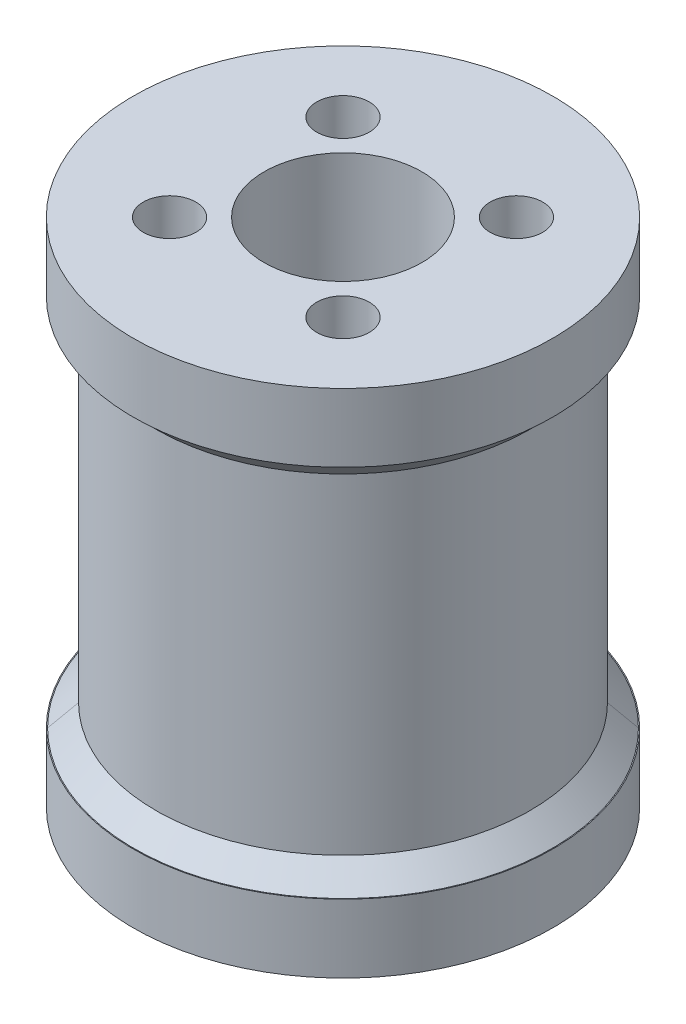
ISO-10303-21;
HEADER;
FILE_DESCRIPTION(('STEP AP214'),'2;1');
FILE_NAME('part.step','',(''),(''),'','','');
FILE_SCHEMA(('AUTOMOTIVE_DESIGN { 1 0 10303 214 1 1 1 1 }'));
ENDSEC;
DATA;
#1=APPLICATION_CONTEXT('core data for automotive mechanical design processes');
#2=APPLICATION_PROTOCOL_DEFINITION('international standard','automotive_design',2000,#1);
#3=PRODUCT_CONTEXT('',#1,'mechanical');
#4=PRODUCT('Part','Part','',(#3));
#5=PRODUCT_RELATED_PRODUCT_CATEGORY('part','',(#4));
#6=PRODUCT_DEFINITION_FORMATION('','',#4);
#7=PRODUCT_DEFINITION_CONTEXT('part definition',#1,'design');
#8=PRODUCT_DEFINITION('design','',#6,#7);
#9=PRODUCT_DEFINITION_SHAPE('','',#8);
#10=(LENGTH_UNIT() NAMED_UNIT(*) SI_UNIT(.MILLI.,.METRE.));
#11=(NAMED_UNIT(*) PLANE_ANGLE_UNIT() SI_UNIT($,.RADIAN.));
#12=(NAMED_UNIT(*) SI_UNIT($,.STERADIAN.) SOLID_ANGLE_UNIT());
#13=UNCERTAINTY_MEASURE_WITH_UNIT(LENGTH_MEASURE(1.E-05),#10,'distance_accuracy_value','');
#14=(GEOMETRIC_REPRESENTATION_CONTEXT(3) GLOBAL_UNCERTAINTY_ASSIGNED_CONTEXT((#13)) GLOBAL_UNIT_ASSIGNED_CONTEXT((#10,
#11,#12)) REPRESENTATION_CONTEXT('',''));
#15=CARTESIAN_POINT('',(0.,0.,0.));
#16=DIRECTION('',(0.,0.,1.));
#17=DIRECTION('',(1.,0.,0.));
#18=AXIS2_PLACEMENT_3D('',#15,#16,#17);
#19=CARTESIAN_POINT('',(-2.38771494566887,150.57,4.93724746830686));
#20=DIRECTION('',(0.,-1.,0.));
#21=DIRECTION('',(0.707106781186548,0.,-0.707106781186547));
#22=AXIS2_PLACEMENT_3D('',#19,#20,#21);
#23=CYLINDRICAL_SURFACE('',#22,1.5);
#24=DIRECTION('',(0.,-1.,0.));
#25=VECTOR('',#24,1.);
#26=CARTESIAN_POINT('',(-3.44837511744869,150.57,5.99790764008668));
#27=LINE('',#26,#25);
#28=CARTESIAN_POINT('',(-3.44837511744869,150.57,5.99790764008668));
#29=VERTEX_POINT('',#28);
#30=CARTESIAN_POINT('',(-3.44837511744866,121.42,5.99790764008665));
#31=VERTEX_POINT('',#30);
#32=EDGE_CURVE('E20',#29,#31,#27,.T.);
#33=ORIENTED_EDGE('',*,*,#32,.F.);
#34=CARTESIAN_POINT('',(-2.38771494566887,150.57,4.93724746830686));
#35=DIRECTION('',(0.,-1.,0.));
#36=DIRECTION('',(0.707106781186548,0.,-0.707106781186547));
#37=AXIS2_PLACEMENT_3D('',#34,#35,#36);
#38=CIRCLE('',#37,1.5);
#39=CARTESIAN_POINT('',(-1.32705477388904,150.57,3.87658729652704));
#40=VERTEX_POINT('',#39);
#41=EDGE_CURVE('E140',#40,#29,#38,.T.);
#42=ORIENTED_EDGE('',*,*,#41,.F.);
#43=DIRECTION('',(0.,-1.,0.));
#44=VECTOR('',#43,1.);
#45=CARTESIAN_POINT('',(-1.32705477388904,150.57,3.87658729652704));
#46=LINE('',#45,#44);
#47=CARTESIAN_POINT('',(-1.32705477388901,121.42,3.87658729652701));
#48=VERTEX_POINT('',#47);
#49=EDGE_CURVE('E246',#40,#48,#46,.T.);
#50=ORIENTED_EDGE('',*,*,#49,.T.);
#51=CARTESIAN_POINT('',(-2.38771494566884,121.42,4.93724746830683));
#52=DIRECTION('',(0.,-1.,0.));
#53=DIRECTION('',(0.707106781186548,0.,-0.707106781186547));
#54=AXIS2_PLACEMENT_3D('',#51,#52,#53);
#55=CIRCLE('',#54,1.5);
#56=EDGE_CURVE('E150',#48,#31,#55,.T.);
#57=ORIENTED_EDGE('',*,*,#56,.T.);
#58=EDGE_LOOP('',(#33,#42,#50,#57));
#59=FACE_BOUND('',#58,.T.);
#60=ADVANCED_FACE('F16',(#59),#23,.F.);
#61=CARTESIAN_POINT('',(7.51177999094282,150.57,4.93724746830685));
#62=DIRECTION('',(0.,-1.,0.));
#63=DIRECTION('',(0.707106781186548,0.,-0.707106781186547));
#64=AXIS2_PLACEMENT_3D('',#61,#62,#63);
#65=CYLINDRICAL_SURFACE('',#64,1.5);
#66=DIRECTION('',(0.,-1.,0.));
#67=VECTOR('',#66,1.);
#68=CARTESIAN_POINT('',(6.45111981916299,150.57,5.99790764008667));
#69=LINE('',#68,#67);
#70=CARTESIAN_POINT('',(6.45111981916299,150.57,5.99790764008667));
#71=VERTEX_POINT('',#70);
#72=CARTESIAN_POINT('',(6.45111981916302,121.42,5.99790764008664));
#73=VERTEX_POINT('',#72);
#74=EDGE_CURVE('E245',#71,#73,#69,.T.);
#75=ORIENTED_EDGE('',*,*,#74,.F.);
#76=CARTESIAN_POINT('',(7.51177999094282,150.57,4.93724746830685));
#77=DIRECTION('',(0.,-1.,0.));
#78=DIRECTION('',(0.707106781186548,0.,-0.707106781186547));
#79=AXIS2_PLACEMENT_3D('',#76,#77,#78);
#80=CIRCLE('',#79,1.5);
#81=CARTESIAN_POINT('',(8.57244016272264,150.57,3.87658729652703));
#82=VERTEX_POINT('',#81);
#83=EDGE_CURVE('E201',#82,#71,#80,.T.);
#84=ORIENTED_EDGE('',*,*,#83,.F.);
#85=DIRECTION('',(0.,-1.,0.));
#86=VECTOR('',#85,1.);
#87=CARTESIAN_POINT('',(8.57244016272264,150.57,3.87658729652703));
#88=LINE('',#87,#86);
#89=CARTESIAN_POINT('',(8.57244016272267,121.42,3.876587296527));
#90=VERTEX_POINT('',#89);
#91=EDGE_CURVE('E229',#82,#90,#88,.T.);
#92=ORIENTED_EDGE('',*,*,#91,.T.);
#93=CARTESIAN_POINT('',(7.51177999094285,121.42,4.93724746830682));
#94=DIRECTION('',(0.,-1.,0.));
#95=DIRECTION('',(0.707106781186548,0.,-0.707106781186547));
#96=AXIS2_PLACEMENT_3D('',#93,#94,#95);
#97=CIRCLE('',#96,1.5);
#98=EDGE_CURVE('E264',#90,#73,#97,.T.);
#99=ORIENTED_EDGE('',*,*,#98,.T.);
#100=EDGE_LOOP('',(#75,#84,#92,#99));
#101=FACE_BOUND('',#100,.T.);
#102=ADVANCED_FACE('F509',(#101),#65,.F.);
#103=CARTESIAN_POINT('',(7.51177999094277,150.57,-4.96224746830483));
#104=DIRECTION('',(0.,-1.,0.));
#105=DIRECTION('',(0.707106781186548,0.,-0.707106781186547));
#106=AXIS2_PLACEMENT_3D('',#103,#104,#105);
#107=CYLINDRICAL_SURFACE('',#106,1.5);
#108=DIRECTION('',(0.,-1.,0.));
#109=VECTOR('',#108,1.);
#110=CARTESIAN_POINT('',(6.45111981916295,150.57,-3.90158729652501));
#111=LINE('',#110,#109);
#112=CARTESIAN_POINT('',(6.45111981916295,150.57,-3.90158729652501));
#113=VERTEX_POINT('',#112);
#114=CARTESIAN_POINT('',(6.45111981916298,121.42,-3.90158729652504));
#115=VERTEX_POINT('',#114);
#116=EDGE_CURVE('E228',#113,#115,#111,.T.);
#117=ORIENTED_EDGE('',*,*,#116,.F.);
#118=CARTESIAN_POINT('',(7.51177999094277,150.57,-4.96224746830483));
#119=DIRECTION('',(0.,-1.,0.));
#120=DIRECTION('',(0.707106781186548,0.,-0.707106781186547));
#121=AXIS2_PLACEMENT_3D('',#118,#119,#120);
#122=CIRCLE('',#121,1.5);
#123=CARTESIAN_POINT('',(8.5724401627226,150.57,-6.02290764008466));
#124=VERTEX_POINT('',#123);
#125=EDGE_CURVE('E258',#124,#113,#122,.T.);
#126=ORIENTED_EDGE('',*,*,#125,.F.);
#127=DIRECTION('',(0.,-1.,0.));
#128=VECTOR('',#127,1.);
#129=CARTESIAN_POINT('',(8.5724401627226,150.57,-6.02290764008466));
#130=LINE('',#129,#128);
#131=CARTESIAN_POINT('',(8.57244016272262,121.42,-6.02290764008468));
#132=VERTEX_POINT('',#131);
#133=EDGE_CURVE('E209',#124,#132,#130,.T.);
#134=ORIENTED_EDGE('',*,*,#133,.T.);
#135=CARTESIAN_POINT('',(7.5117799909428,121.42,-4.96224746830486));
#136=DIRECTION('',(0.,-1.,0.));
#137=DIRECTION('',(0.707106781186548,0.,-0.707106781186547));
#138=AXIS2_PLACEMENT_3D('',#135,#136,#137);
#139=CIRCLE('',#138,1.5);
#140=EDGE_CURVE('E261',#132,#115,#139,.T.);
#141=ORIENTED_EDGE('',*,*,#140,.T.);
#142=EDGE_LOOP('',(#117,#126,#134,#141));
#143=FACE_BOUND('',#142,.T.);
#144=ADVANCED_FACE('F547',(#143),#107,.F.);
#145=CARTESIAN_POINT('',(-2.38771494566891,150.57,-4.96224746830475));
#146=DIRECTION('',(0.,-1.,0.));
#147=DIRECTION('',(0.707106781186548,0.,-0.707106781186547));
#148=AXIS2_PLACEMENT_3D('',#145,#146,#147);
#149=CYLINDRICAL_SURFACE('',#148,1.5);
#150=DIRECTION('',(0.,-1.,0.));
#151=VECTOR('',#150,1.);
#152=CARTESIAN_POINT('',(-3.44837511744873,150.57,-3.90158729652493));
#153=LINE('',#152,#151);
#154=CARTESIAN_POINT('',(-3.44837511744873,150.57,-3.90158729652493));
#155=VERTEX_POINT('',#154);
#156=CARTESIAN_POINT('',(-3.4483751174487,121.42,-3.90158729652496));
#157=VERTEX_POINT('',#156);
#158=EDGE_CURVE('E329',#155,#157,#153,.T.);
#159=ORIENTED_EDGE('',*,*,#158,.F.);
#160=CARTESIAN_POINT('',(-2.38771494566891,150.57,-4.96224746830475));
#161=DIRECTION('',(0.,-1.,0.));
#162=DIRECTION('',(0.707106781186548,0.,-0.707106781186547));
#163=AXIS2_PLACEMENT_3D('',#160,#161,#162);
#164=CIRCLE('',#163,1.5);
#165=CARTESIAN_POINT('',(-1.32705477388909,150.57,-6.02290764008457));
#166=VERTEX_POINT('',#165);
#167=EDGE_CURVE('E255',#166,#155,#164,.T.);
#168=ORIENTED_EDGE('',*,*,#167,.F.);
#169=DIRECTION('',(0.,-1.,0.));
#170=VECTOR('',#169,1.);
#171=CARTESIAN_POINT('',(-1.32705477388909,150.57,-6.02290764008457));
#172=LINE('',#171,#170);
#173=CARTESIAN_POINT('',(-1.32705477388906,121.42,-6.0229076400846));
#174=VERTEX_POINT('',#173);
#175=EDGE_CURVE('E208',#166,#174,#172,.T.);
#176=ORIENTED_EDGE('',*,*,#175,.T.);
#177=CARTESIAN_POINT('',(-2.38771494566888,121.42,-4.96224746830478));
#178=DIRECTION('',(0.,-1.,0.));
#179=DIRECTION('',(0.707106781186548,0.,-0.707106781186547));
#180=AXIS2_PLACEMENT_3D('',#177,#178,#179);
#181=CIRCLE('',#180,1.5);
#182=EDGE_CURVE('E263',#174,#157,#181,.T.);
#183=ORIENTED_EDGE('',*,*,#182,.T.);
#184=EDGE_LOOP('',(#159,#168,#176,#183));
#185=FACE_BOUND('',#184,.T.);
#186=ADVANCED_FACE('F605',(#185),#149,.F.);
#187=CARTESIAN_POINT('',(2.56203252263697,150.57,-0.0124999999989708));
#188=DIRECTION('',(0.,-1.,0.));
#189=DIRECTION('',(0.707106781186548,0.,-0.707106781186547));
#190=AXIS2_PLACEMENT_3D('',#187,#188,#189);
#191=CYLINDRICAL_SURFACE('',#190,4.5);
#192=DIRECTION('',(0.,-1.,0.));
#193=VECTOR('',#192,1.);
#194=CARTESIAN_POINT('',(-0.619947992702494,150.57,3.16948051534049));
#195=LINE('',#194,#193);
#196=CARTESIAN_POINT('',(-0.619947992702494,150.57,3.16948051534049));
#197=VERTEX_POINT('',#196);
#198=CARTESIAN_POINT('',(-0.619947992702465,121.42,3.16948051534046));
#199=VERTEX_POINT('',#198);
#200=EDGE_CURVE('E207',#197,#199,#195,.T.);
#201=ORIENTED_EDGE('',*,*,#200,.F.);
#202=CARTESIAN_POINT('',(2.56203252263697,150.57,-0.0124999999989708));
#203=DIRECTION('',(0.,-1.,0.));
#204=DIRECTION('',(0.707106781186548,0.,-0.707106781186547));
#205=AXIS2_PLACEMENT_3D('',#202,#203,#204);
#206=CIRCLE('',#205,4.5);
#207=CARTESIAN_POINT('',(5.74401303797644,150.57,-3.19448051533843));
#208=VERTEX_POINT('',#207);
#209=EDGE_CURVE('E27',#208,#197,#206,.T.);
#210=ORIENTED_EDGE('',*,*,#209,.F.);
#211=DIRECTION('',(0.,-1.,0.));
#212=VECTOR('',#211,1.);
#213=CARTESIAN_POINT('',(5.74401303797644,150.57,-3.19448051533843));
#214=LINE('',#213,#212);
#215=CARTESIAN_POINT('',(5.74401303797647,121.42,-3.19448051533846));
#216=VERTEX_POINT('',#215);
#217=EDGE_CURVE('E299',#208,#216,#214,.T.);
#218=ORIENTED_EDGE('',*,*,#217,.T.);
#219=CARTESIAN_POINT('',(2.562032522637,121.42,-0.012499999999));
#220=DIRECTION('',(0.,-1.,0.));
#221=DIRECTION('',(0.707106781186548,0.,-0.707106781186547));
#222=AXIS2_PLACEMENT_3D('',#219,#220,#221);
#223=CIRCLE('',#222,4.5);
#224=EDGE_CURVE('E240',#216,#199,#223,.T.);
#225=ORIENTED_EDGE('',*,*,#224,.T.);
#226=EDGE_LOOP('',(#201,#210,#218,#225));
#227=FACE_BOUND('',#226,.T.);
#228=ADVANCED_FACE('F819',(#227),#191,.F.);
#229=CARTESIAN_POINT('',(2.56203252263697,146.67,-0.0124999999989747));
#230=DIRECTION('',(0.,1.,0.));
#231=DIRECTION('',(-0.707106781186548,0.,0.707106781186547));
#232=AXIS2_PLACEMENT_3D('',#229,#230,#231);
#233=CONICAL_SURFACE('',#232,11.925,0.785398163397455);
#234=DIRECTION('',(0.500000000000003,0.707106781186544,-0.500000000000002));
#235=VECTOR('',#234,1.);
#236=CARTESIAN_POINT('',(10.9942808882866,146.67,-8.44474836564855));
#237=LINE('',#236,#235);
#238=CARTESIAN_POINT('',(10.1103974118034,145.42,-7.56086488916537));
#239=VERTEX_POINT('',#238);
#240=CARTESIAN_POINT('',(10.9942808882866,146.67,-8.44474836564855));
#241=VERTEX_POINT('',#240);
#242=EDGE_CURVE('E230',#239,#241,#237,.T.);
#243=ORIENTED_EDGE('',*,*,#242,.F.);
#244=CARTESIAN_POINT('',(2.56203252263698,145.42,-0.012499999998976));
#245=DIRECTION('',(0.,-1.,0.));
#246=DIRECTION('',(-0.707106781186548,0.,0.707106781186547));
#247=AXIS2_PLACEMENT_3D('',#244,#245,#246);
#248=CIRCLE('',#247,10.675);
#249=CARTESIAN_POINT('',(-4.98633236652942,145.42,7.53586488916741));
#250=VERTEX_POINT('',#249);
#251=EDGE_CURVE('E236',#250,#239,#248,.T.);
#252=ORIENTED_EDGE('',*,*,#251,.F.);
#253=DIRECTION('',(-0.500000000000004,0.707106781186542,0.500000000000003));
#254=VECTOR('',#253,1.);
#255=CARTESIAN_POINT('',(-5.87021584301261,146.67,8.4197483656506));
#256=LINE('',#255,#254);
#257=CARTESIAN_POINT('',(-5.87021584301261,146.67,8.4197483656506));
#258=VERTEX_POINT('',#257);
#259=EDGE_CURVE('E306',#250,#258,#256,.T.);
#260=ORIENTED_EDGE('',*,*,#259,.T.);
#261=CARTESIAN_POINT('',(2.56203252263697,146.67,-0.0124999999989747));
#262=DIRECTION('',(0.,1.,0.));
#263=DIRECTION('',(-0.707106781186548,0.,0.707106781186547));
#264=AXIS2_PLACEMENT_3D('',#261,#262,#263);
#265=CIRCLE('',#264,11.925);
#266=EDGE_CURVE('E10',#241,#258,#265,.T.);
#267=ORIENTED_EDGE('',*,*,#266,.F.);
#268=EDGE_LOOP('',(#243,#252,#260,#267));
#269=FACE_BOUND('',#268,.T.);
#270=ADVANCED_FACE('F580',(#269),#233,.T.);
#271=CARTESIAN_POINT('',(2.56203252263699,126.57,-0.0124999999989948));
#272=DIRECTION('',(0.,-1.,0.));
#273=DIRECTION('',(0.707106781186548,0.,-0.707106781186547));
#274=AXIS2_PLACEMENT_3D('',#271,#272,#273);
#275=CONICAL_SURFACE('',#274,10.675,0.785398163397445);
#276=DIRECTION('',(-0.499999999999998,-0.707106781186551,0.499999999999997));
#277=VECTOR('',#276,1.);
#278=CARTESIAN_POINT('',(-4.9863323665294,126.57,7.5358648891674));
#279=LINE('',#278,#277);
#280=CARTESIAN_POINT('',(-4.9863323665294,126.57,7.5358648891674));
#281=VERTEX_POINT('',#280);
#282=CARTESIAN_POINT('',(-5.87021584301259,125.32,8.41974836565058));
#283=VERTEX_POINT('',#282);
#284=EDGE_CURVE('E307',#281,#283,#279,.T.);
#285=ORIENTED_EDGE('',*,*,#284,.F.);
#286=CARTESIAN_POINT('',(2.56203252263699,126.57,-0.0124999999989948));
#287=DIRECTION('',(0.,1.,0.));
#288=DIRECTION('',(-0.707106781186548,0.,0.707106781186547));
#289=AXIS2_PLACEMENT_3D('',#286,#287,#288);
#290=CIRCLE('',#289,10.675);
#291=CARTESIAN_POINT('',(10.1103974118034,126.57,-7.56086488916539));
#292=VERTEX_POINT('',#291);
#293=EDGE_CURVE('E198',#292,#281,#290,.T.);
#294=ORIENTED_EDGE('',*,*,#293,.F.);
#295=DIRECTION('',(0.499999999999999,-0.707106781186549,-0.499999999999999));
#296=VECTOR('',#295,1.);
#297=CARTESIAN_POINT('',(10.1103974118034,126.57,-7.56086488916539));
#298=LINE('',#297,#296);
#299=CARTESIAN_POINT('',(10.9942808882866,125.32,-8.44474836564857));
#300=VERTEX_POINT('',#299);
#301=EDGE_CURVE('E218',#292,#300,#298,.T.);
#302=ORIENTED_EDGE('',*,*,#301,.T.);
#303=CARTESIAN_POINT('',(2.562032522637,125.32,-0.0124999999989961));
#304=DIRECTION('',(0.,-1.,0.));
#305=DIRECTION('',(-0.707106781186548,0.,0.707106781186547));
#306=AXIS2_PLACEMENT_3D('',#303,#304,#305);
#307=CIRCLE('',#306,11.925);
#308=EDGE_CURVE('E217',#283,#300,#307,.T.);
#309=ORIENTED_EDGE('',*,*,#308,.F.);
#310=EDGE_LOOP('',(#285,#294,#302,#309));
#311=FACE_BOUND('',#310,.T.);
#312=ADVANCED_FACE('F800',(#311),#275,.T.);
#313=CARTESIAN_POINT('',(2.56203252263697,146.67,-0.0124999999989747));
#314=DIRECTION('',(0.,1.,0.));
#315=DIRECTION('',(0.707106781186547,0.,0.707106781186548));
#316=AXIS2_PLACEMENT_3D('',#313,#314,#315);
#317=PLANE('',#316);
#318=CARTESIAN_POINT('',(2.56203252263697,146.67,-0.0124999999989747));
#319=DIRECTION('',(0.,1.,0.));
#320=DIRECTION('',(-0.707106781186548,0.,0.707106781186547));
#321=AXIS2_PLACEMENT_3D('',#318,#319,#320);
#322=CIRCLE('',#321,11.925);
#323=EDGE_CURVE('E234',#258,#241,#322,.T.);
#324=ORIENTED_EDGE('',*,*,#323,.T.);
#325=ORIENTED_EDGE('',*,*,#266,.T.);
#326=EDGE_LOOP('',(#324,#325));
#327=FACE_BOUND('',#326,.T.);
#328=CARTESIAN_POINT('',(2.56203252263697,146.67,-0.0124999999989747));
#329=DIRECTION('',(0.,1.,0.));
#330=DIRECTION('',(-0.707106781186548,0.,0.707106781186547));
#331=AXIS2_PLACEMENT_3D('',#328,#329,#330);
#332=CIRCLE('',#331,11.975);
#333=CARTESIAN_POINT('',(11.0296362273459,146.67,-8.48010370470787));
#334=VERTEX_POINT('',#333);
#335=CARTESIAN_POINT('',(-5.90557118207194,146.67,8.45510370470993));
#336=VERTEX_POINT('',#335);
#337=EDGE_CURVE('E202',#334,#336,#332,.T.);
#338=ORIENTED_EDGE('',*,*,#337,.F.);
#339=CARTESIAN_POINT('',(2.56203252263697,146.67,-0.0124999999989747));
#340=DIRECTION('',(0.,1.,0.));
#341=DIRECTION('',(-0.707106781186548,0.,0.707106781186547));
#342=AXIS2_PLACEMENT_3D('',#339,#340,#341);
#343=CIRCLE('',#342,11.975);
#344=EDGE_CURVE('E268',#336,#334,#343,.T.);
#345=ORIENTED_EDGE('',*,*,#344,.F.);
#346=EDGE_LOOP('',(#338,#345));
#347=FACE_BOUND('',#346,.T.);
#348=ADVANCED_FACE('F518',(#327,#347),#317,.F.);
#349=CARTESIAN_POINT('',(2.56203252263697,150.57,-0.0124999999989708));
#350=DIRECTION('',(0.,1.,0.));
#351=DIRECTION('',(0.707106781186547,0.,0.707106781186548));
#352=AXIS2_PLACEMENT_3D('',#349,#350,#351);
#353=PLANE('',#352);
#354=ORIENTED_EDGE('',*,*,#209,.T.);
#355=CARTESIAN_POINT('',(2.56203252263697,150.57,-0.0124999999989708));
#356=DIRECTION('',(0.,-1.,0.));
#357=DIRECTION('',(0.707106781186548,0.,-0.707106781186547));
#358=AXIS2_PLACEMENT_3D('',#355,#356,#357);
#359=CIRCLE('',#358,4.5);
#360=EDGE_CURVE('E203',#197,#208,#359,.T.);
#361=ORIENTED_EDGE('',*,*,#360,.T.);
#362=EDGE_LOOP('',(#354,#361));
#363=FACE_BOUND('',#362,.T.);
#364=ORIENTED_EDGE('',*,*,#167,.T.);
#365=CARTESIAN_POINT('',(-2.38771494566891,150.57,-4.96224746830475));
#366=DIRECTION('',(0.,-1.,0.));
#367=DIRECTION('',(0.707106781186548,0.,-0.707106781186547));
#368=AXIS2_PLACEMENT_3D('',#365,#366,#367);
#369=CIRCLE('',#368,1.5);
#370=EDGE_CURVE('E213',#155,#166,#369,.T.);
#371=ORIENTED_EDGE('',*,*,#370,.T.);
#372=EDGE_LOOP('',(#364,#371));
#373=FACE_BOUND('',#372,.T.);
#374=ORIENTED_EDGE('',*,*,#125,.T.);
#375=CARTESIAN_POINT('',(7.51177999094277,150.57,-4.96224746830483));
#376=DIRECTION('',(0.,-1.,0.));
#377=DIRECTION('',(0.707106781186548,0.,-0.707106781186547));
#378=AXIS2_PLACEMENT_3D('',#375,#376,#377);
#379=CIRCLE('',#378,1.5);
#380=EDGE_CURVE('E224',#113,#124,#379,.T.);
#381=ORIENTED_EDGE('',*,*,#380,.T.);
#382=EDGE_LOOP('',(#374,#381));
#383=FACE_BOUND('',#382,.T.);
#384=ORIENTED_EDGE('',*,*,#83,.T.);
#385=CARTESIAN_POINT('',(7.51177999094282,150.57,4.93724746830685));
#386=DIRECTION('',(0.,-1.,0.));
#387=DIRECTION('',(0.707106781186548,0.,-0.707106781186547));
#388=AXIS2_PLACEMENT_3D('',#385,#386,#387);
#389=CIRCLE('',#388,1.5);
#390=EDGE_CURVE('E241',#71,#82,#389,.T.);
#391=ORIENTED_EDGE('',*,*,#390,.T.);
#392=EDGE_LOOP('',(#384,#391));
#393=FACE_BOUND('',#392,.T.);
#394=ORIENTED_EDGE('',*,*,#41,.T.);
#395=CARTESIAN_POINT('',(-2.38771494566887,150.57,4.93724746830686));
#396=DIRECTION('',(0.,-1.,0.));
#397=DIRECTION('',(0.707106781186548,0.,-0.707106781186547));
#398=AXIS2_PLACEMENT_3D('',#395,#396,#397);
#399=CIRCLE('',#398,1.5);
#400=EDGE_CURVE('E354',#29,#40,#399,.T.);
#401=ORIENTED_EDGE('',*,*,#400,.T.);
#402=EDGE_LOOP('',(#394,#401));
#403=FACE_BOUND('',#402,.T.);
#404=CARTESIAN_POINT('',(2.56203252263697,150.57,-0.0124999999989708));
#405=DIRECTION('',(0.,1.,0.));
#406=DIRECTION('',(-0.707106781186548,0.,0.707106781186547));
#407=AXIS2_PLACEMENT_3D('',#404,#405,#406);
#408=CIRCLE('',#407,11.975);
#409=CARTESIAN_POINT('',(11.0296362273459,150.57,-8.48010370470787));
#410=VERTEX_POINT('',#409);
#411=CARTESIAN_POINT('',(-5.90557118207194,150.57,8.45510370470993));
#412=VERTEX_POINT('',#411);
#413=EDGE_CURVE('E325',#410,#412,#408,.T.);
#414=ORIENTED_EDGE('',*,*,#413,.T.);
#415=CARTESIAN_POINT('',(2.56203252263697,150.57,-0.0124999999989708));
#416=DIRECTION('',(0.,1.,0.));
#417=DIRECTION('',(-0.707106781186548,0.,0.707106781186547));
#418=AXIS2_PLACEMENT_3D('',#415,#416,#417);
#419=CIRCLE('',#418,11.975);
#420=EDGE_CURVE('E222',#412,#410,#419,.T.);
#421=ORIENTED_EDGE('',*,*,#420,.T.);
#422=EDGE_LOOP('',(#414,#421));
#423=FACE_BOUND('',#422,.T.);
#424=ADVANCED_FACE('F377',(#363,#373,#383,#393,#403,#423),#353,.T.);
#425=CARTESIAN_POINT('',(2.56203252263697,150.57,-0.0124999999989708));
#426=DIRECTION('',(0.,-1.,0.));
#427=DIRECTION('',(0.707106781186548,0.,-0.707106781186547));
#428=AXIS2_PLACEMENT_3D('',#425,#426,#427);
#429=CYLINDRICAL_SURFACE('',#428,11.975);
#430=DIRECTION('',(0.,-1.,0.));
#431=VECTOR('',#430,1.);
#432=CARTESIAN_POINT('',(-5.90557118207194,150.57,8.45510370470993));
#433=LINE('',#432,#431);
#434=EDGE_CURVE('E280',#412,#336,#433,.T.);
#435=ORIENTED_EDGE('',*,*,#434,.F.);
#436=ORIENTED_EDGE('',*,*,#413,.F.);
#437=DIRECTION('',(0.,-1.,0.));
#438=VECTOR('',#437,1.);
#439=CARTESIAN_POINT('',(11.0296362273459,150.57,-8.48010370470787));
#440=LINE('',#439,#438);
#441=EDGE_CURVE('E265',#410,#334,#440,.T.);
#442=ORIENTED_EDGE('',*,*,#441,.T.);
#443=ORIENTED_EDGE('',*,*,#337,.T.);
#444=EDGE_LOOP('',(#435,#436,#442,#443));
#445=FACE_BOUND('',#444,.T.);
#446=ADVANCED_FACE('F517',(#445),#429,.T.);
#447=CARTESIAN_POINT('',(2.56203252263697,146.67,-0.0124999999989747));
#448=DIRECTION('',(0.,-1.,0.));
#449=DIRECTION('',(0.707106781186548,0.,-0.707106781186547));
#450=AXIS2_PLACEMENT_3D('',#447,#448,#449);
#451=CYLINDRICAL_SURFACE('',#450,10.675);
#452=DIRECTION('',(0.,-1.,0.));
#453=VECTOR('',#452,1.);
#454=CARTESIAN_POINT('',(-4.98633236652942,146.67,7.53586488916742));
#455=LINE('',#454,#453);
#456=EDGE_CURVE('E194',#250,#281,#455,.T.);
#457=ORIENTED_EDGE('',*,*,#456,.F.);
#458=ORIENTED_EDGE('',*,*,#251,.T.);
#459=DIRECTION('',(0.,-1.,0.));
#460=VECTOR('',#459,1.);
#461=CARTESIAN_POINT('',(10.1103974118034,146.67,-7.56086488916536));
#462=LINE('',#461,#460);
#463=EDGE_CURVE('E184',#239,#292,#462,.T.);
#464=ORIENTED_EDGE('',*,*,#463,.T.);
#465=ORIENTED_EDGE('',*,*,#293,.T.);
#466=EDGE_LOOP('',(#457,#458,#464,#465));
#467=FACE_BOUND('',#466,.T.);
#468=ADVANCED_FACE('F528',(#467),#451,.T.);
#469=CARTESIAN_POINT('',(2.562032522637,121.42,-0.012499999999));
#470=DIRECTION('',(0.,1.,0.));
#471=DIRECTION('',(0.707106781186547,0.,0.707106781186548));
#472=AXIS2_PLACEMENT_3D('',#469,#470,#471);
#473=PLANE('',#472);
#474=ORIENTED_EDGE('',*,*,#224,.F.);
#475=CARTESIAN_POINT('',(2.562032522637,121.42,-0.012499999999));
#476=DIRECTION('',(0.,-1.,0.));
#477=DIRECTION('',(0.707106781186548,0.,-0.707106781186547));
#478=AXIS2_PLACEMENT_3D('',#475,#476,#477);
#479=CIRCLE('',#478,4.5);
#480=EDGE_CURVE('E295',#199,#216,#479,.T.);
#481=ORIENTED_EDGE('',*,*,#480,.F.);
#482=EDGE_LOOP('',(#474,#481));
#483=FACE_BOUND('',#482,.T.);
#484=ORIENTED_EDGE('',*,*,#182,.F.);
#485=CARTESIAN_POINT('',(-2.38771494566888,121.42,-4.96224746830478));
#486=DIRECTION('',(0.,-1.,0.));
#487=DIRECTION('',(0.707106781186548,0.,-0.707106781186547));
#488=AXIS2_PLACEMENT_3D('',#485,#486,#487);
#489=CIRCLE('',#488,1.5);
#490=EDGE_CURVE('E254',#157,#174,#489,.T.);
#491=ORIENTED_EDGE('',*,*,#490,.F.);
#492=EDGE_LOOP('',(#484,#491));
#493=FACE_BOUND('',#492,.T.);
#494=ORIENTED_EDGE('',*,*,#140,.F.);
#495=CARTESIAN_POINT('',(7.5117799909428,121.42,-4.96224746830486));
#496=DIRECTION('',(0.,-1.,0.));
#497=DIRECTION('',(0.707106781186548,0.,-0.707106781186547));
#498=AXIS2_PLACEMENT_3D('',#495,#496,#497);
#499=CIRCLE('',#498,1.5);
#500=EDGE_CURVE('E214',#115,#132,#499,.T.);
#501=ORIENTED_EDGE('',*,*,#500,.F.);
#502=EDGE_LOOP('',(#494,#501));
#503=FACE_BOUND('',#502,.T.);
#504=ORIENTED_EDGE('',*,*,#98,.F.);
#505=CARTESIAN_POINT('',(7.51177999094285,121.42,4.93724746830682));
#506=DIRECTION('',(0.,-1.,0.));
#507=DIRECTION('',(0.707106781186548,0.,-0.707106781186547));
#508=AXIS2_PLACEMENT_3D('',#505,#506,#507);
#509=CIRCLE('',#508,1.5);
#510=EDGE_CURVE('E247',#73,#90,#509,.T.);
#511=ORIENTED_EDGE('',*,*,#510,.F.);
#512=EDGE_LOOP('',(#504,#511));
#513=FACE_BOUND('',#512,.T.);
#514=ORIENTED_EDGE('',*,*,#56,.F.);
#515=CARTESIAN_POINT('',(-2.38771494566884,121.42,4.93724746830683));
#516=DIRECTION('',(0.,-1.,0.));
#517=DIRECTION('',(0.707106781186548,0.,-0.707106781186547));
#518=AXIS2_PLACEMENT_3D('',#515,#516,#517);
#519=CIRCLE('',#518,1.5);
#520=EDGE_CURVE('E317',#31,#48,#519,.T.);
#521=ORIENTED_EDGE('',*,*,#520,.F.);
#522=EDGE_LOOP('',(#514,#521));
#523=FACE_BOUND('',#522,.T.);
#524=CARTESIAN_POINT('',(2.562032522637,121.42,-0.012499999999));
#525=DIRECTION('',(0.,1.,0.));
#526=DIRECTION('',(-0.707106781186548,0.,0.707106781186547));
#527=AXIS2_PLACEMENT_3D('',#524,#525,#526);
#528=CIRCLE('',#527,11.975);
#529=CARTESIAN_POINT('',(11.0296362273459,121.42,-8.4801037047079));
#530=VERTEX_POINT('',#529);
#531=CARTESIAN_POINT('',(-5.90557118207191,121.42,8.4551037047099));
#532=VERTEX_POINT('',#531);
#533=EDGE_CURVE('E41',#530,#532,#528,.T.);
#534=ORIENTED_EDGE('',*,*,#533,.F.);
#535=CARTESIAN_POINT('',(2.562032522637,121.42,-0.012499999999));
#536=DIRECTION('',(0.,1.,0.));
#537=DIRECTION('',(-0.707106781186548,0.,0.707106781186547));
#538=AXIS2_PLACEMENT_3D('',#535,#536,#537);
#539=CIRCLE('',#538,11.975);
#540=EDGE_CURVE('E179',#532,#530,#539,.T.);
#541=ORIENTED_EDGE('',*,*,#540,.F.);
#542=EDGE_LOOP('',(#534,#541));
#543=FACE_BOUND('',#542,.T.);
#544=ADVANCED_FACE('F526',(#483,#493,#503,#513,#523,#543),#473,.F.);
#545=CARTESIAN_POINT('',(2.562032522637,125.32,-0.0124999999989961));
#546=DIRECTION('',(0.,1.,0.));
#547=DIRECTION('',(0.707106781186547,0.,0.707106781186548));
#548=AXIS2_PLACEMENT_3D('',#545,#546,#547);
#549=PLANE('',#548);
#550=CARTESIAN_POINT('',(2.562032522637,125.32,-0.0124999999989961));
#551=DIRECTION('',(0.,-1.,0.));
#552=DIRECTION('',(-0.707106781186548,0.,0.707106781186547));
#553=AXIS2_PLACEMENT_3D('',#550,#551,#552);
#554=CIRCLE('',#553,11.925);
#555=EDGE_CURVE('E223',#300,#283,#554,.T.);
#556=ORIENTED_EDGE('',*,*,#555,.T.);
#557=ORIENTED_EDGE('',*,*,#308,.T.);
#558=EDGE_LOOP('',(#556,#557));
#559=FACE_BOUND('',#558,.T.);
#560=CARTESIAN_POINT('',(2.562032522637,125.32,-0.0124999999989961));
#561=DIRECTION('',(0.,1.,0.));
#562=DIRECTION('',(-0.707106781186548,0.,0.707106781186547));
#563=AXIS2_PLACEMENT_3D('',#560,#561,#562);
#564=CIRCLE('',#563,11.975);
#565=CARTESIAN_POINT('',(11.0296362273459,125.32,-8.4801037047079));
#566=VERTEX_POINT('',#565);
#567=CARTESIAN_POINT('',(-5.90557118207192,125.32,8.45510370470991));
#568=VERTEX_POINT('',#567);
#569=EDGE_CURVE('E164',#566,#568,#564,.T.);
#570=ORIENTED_EDGE('',*,*,#569,.T.);
#571=CARTESIAN_POINT('',(2.562032522637,125.32,-0.0124999999989961));
#572=DIRECTION('',(0.,1.,0.));
#573=DIRECTION('',(-0.707106781186548,0.,0.707106781186547));
#574=AXIS2_PLACEMENT_3D('',#571,#572,#573);
#575=CIRCLE('',#574,11.975);
#576=EDGE_CURVE('E178',#568,#566,#575,.T.);
#577=ORIENTED_EDGE('',*,*,#576,.T.);
#578=EDGE_LOOP('',(#570,#577));
#579=FACE_BOUND('',#578,.T.);
#580=ADVANCED_FACE('F182',(#559,#579),#549,.T.);
#581=CARTESIAN_POINT('',(2.562032522637,125.32,-0.0124999999989961));
#582=DIRECTION('',(0.,-1.,0.));
#583=DIRECTION('',(0.707106781186548,0.,-0.707106781186547));
#584=AXIS2_PLACEMENT_3D('',#581,#582,#583);
#585=CYLINDRICAL_SURFACE('',#584,11.975);
#586=DIRECTION('',(0.,-1.,0.));
#587=VECTOR('',#586,1.);
#588=CARTESIAN_POINT('',(-5.90557118207192,125.32,8.45510370470991));
#589=LINE('',#588,#587);
#590=EDGE_CURVE('E170',#568,#532,#589,.T.);
#591=ORIENTED_EDGE('',*,*,#590,.F.);
#592=ORIENTED_EDGE('',*,*,#569,.F.);
#593=DIRECTION('',(0.,-1.,0.));
#594=VECTOR('',#593,1.);
#595=CARTESIAN_POINT('',(11.0296362273459,125.32,-8.4801037047079));
#596=LINE('',#595,#594);
#597=EDGE_CURVE('E167',#566,#530,#596,.T.);
#598=ORIENTED_EDGE('',*,*,#597,.T.);
#599=ORIENTED_EDGE('',*,*,#533,.T.);
#600=EDGE_LOOP('',(#591,#592,#598,#599));
#601=FACE_BOUND('',#600,.T.);
#602=ADVANCED_FACE('F166',(#601),#585,.T.);
#603=CARTESIAN_POINT('',(2.562032522637,125.32,-0.0124999999989961));
#604=DIRECTION('',(0.,-1.,0.));
#605=DIRECTION('',(0.707106781186548,0.,-0.707106781186547));
#606=AXIS2_PLACEMENT_3D('',#603,#604,#605);
#607=CYLINDRICAL_SURFACE('',#606,11.975);
#608=ORIENTED_EDGE('',*,*,#576,.F.);
#609=ORIENTED_EDGE('',*,*,#590,.T.);
#610=ORIENTED_EDGE('',*,*,#540,.T.);
#611=ORIENTED_EDGE('',*,*,#597,.F.);
#612=EDGE_LOOP('',(#608,#609,#610,#611));
#613=FACE_BOUND('',#612,.T.);
#614=ADVANCED_FACE('F177',(#613),#607,.T.);
#615=CARTESIAN_POINT('',(2.56203252263697,146.67,-0.0124999999989747));
#616=DIRECTION('',(0.,-1.,0.));
#617=DIRECTION('',(0.707106781186548,0.,-0.707106781186547));
#618=AXIS2_PLACEMENT_3D('',#615,#616,#617);
#619=CYLINDRICAL_SURFACE('',#618,10.675);
#620=CARTESIAN_POINT('',(2.56203252263698,145.42,-0.012499999998976));
#621=DIRECTION('',(0.,-1.,0.));
#622=DIRECTION('',(-0.707106781186548,0.,0.707106781186547));
#623=AXIS2_PLACEMENT_3D('',#620,#621,#622);
#624=CIRCLE('',#623,10.675);
#625=EDGE_CURVE('E235',#239,#250,#624,.T.);
#626=ORIENTED_EDGE('',*,*,#625,.T.);
#627=ORIENTED_EDGE('',*,*,#456,.T.);
#628=CARTESIAN_POINT('',(2.56203252263699,126.57,-0.0124999999989948));
#629=DIRECTION('',(0.,1.,0.));
#630=DIRECTION('',(-0.707106781186548,0.,0.707106781186547));
#631=AXIS2_PLACEMENT_3D('',#628,#629,#630);
#632=CIRCLE('',#631,10.675);
#633=EDGE_CURVE('E311',#281,#292,#632,.T.);
#634=ORIENTED_EDGE('',*,*,#633,.T.);
#635=ORIENTED_EDGE('',*,*,#463,.F.);
#636=EDGE_LOOP('',(#626,#627,#634,#635));
#637=FACE_BOUND('',#636,.T.);
#638=ADVANCED_FACE('F18',(#637),#619,.T.);
#639=CARTESIAN_POINT('',(2.56203252263697,150.57,-0.0124999999989708));
#640=DIRECTION('',(0.,-1.,0.));
#641=DIRECTION('',(0.707106781186548,0.,-0.707106781186547));
#642=AXIS2_PLACEMENT_3D('',#639,#640,#641);
#643=CYLINDRICAL_SURFACE('',#642,11.975);
#644=ORIENTED_EDGE('',*,*,#420,.F.);
#645=ORIENTED_EDGE('',*,*,#434,.T.);
#646=ORIENTED_EDGE('',*,*,#344,.T.);
#647=ORIENTED_EDGE('',*,*,#441,.F.);
#648=EDGE_LOOP('',(#644,#645,#646,#647));
#649=FACE_BOUND('',#648,.T.);
#650=ADVANCED_FACE('F381',(#649),#643,.T.);
#651=CARTESIAN_POINT('',(2.56203252263699,126.57,-0.0124999999989948));
#652=DIRECTION('',(0.,-1.,0.));
#653=DIRECTION('',(0.707106781186548,0.,-0.707106781186547));
#654=AXIS2_PLACEMENT_3D('',#651,#652,#653);
#655=CONICAL_SURFACE('',#654,10.675,0.785398163397445);
#656=ORIENTED_EDGE('',*,*,#633,.F.);
#657=ORIENTED_EDGE('',*,*,#284,.T.);
#658=ORIENTED_EDGE('',*,*,#555,.F.);
#659=ORIENTED_EDGE('',*,*,#301,.F.);
#660=EDGE_LOOP('',(#656,#657,#658,#659));
#661=FACE_BOUND('',#660,.T.);
#662=ADVANCED_FACE('F554',(#661),#655,.T.);
#663=CARTESIAN_POINT('',(2.56203252263697,146.67,-0.0124999999989747));
#664=DIRECTION('',(0.,1.,0.));
#665=DIRECTION('',(-0.707106781186548,0.,0.707106781186547));
#666=AXIS2_PLACEMENT_3D('',#663,#664,#665);
#667=CONICAL_SURFACE('',#666,11.925,0.785398163397455);
#668=ORIENTED_EDGE('',*,*,#625,.F.);
#669=ORIENTED_EDGE('',*,*,#242,.T.);
#670=ORIENTED_EDGE('',*,*,#323,.F.);
#671=ORIENTED_EDGE('',*,*,#259,.F.);
#672=EDGE_LOOP('',(#668,#669,#670,#671));
#673=FACE_BOUND('',#672,.T.);
#674=ADVANCED_FACE('F551',(#673),#667,.T.);
#675=CARTESIAN_POINT('',(2.56203252263697,150.57,-0.0124999999989708));
#676=DIRECTION('',(0.,-1.,0.));
#677=DIRECTION('',(0.707106781186548,0.,-0.707106781186547));
#678=AXIS2_PLACEMENT_3D('',#675,#676,#677);
#679=CYLINDRICAL_SURFACE('',#678,4.5);
#680=ORIENTED_EDGE('',*,*,#360,.F.);
#681=ORIENTED_EDGE('',*,*,#200,.T.);
#682=ORIENTED_EDGE('',*,*,#480,.T.);
#683=ORIENTED_EDGE('',*,*,#217,.F.);
#684=EDGE_LOOP('',(#680,#681,#682,#683));
#685=FACE_BOUND('',#684,.T.);
#686=ADVANCED_FACE('F553',(#685),#679,.F.);
#687=CARTESIAN_POINT('',(-2.38771494566891,150.57,-4.96224746830475));
#688=DIRECTION('',(0.,-1.,0.));
#689=DIRECTION('',(0.707106781186548,0.,-0.707106781186547));
#690=AXIS2_PLACEMENT_3D('',#687,#688,#689);
#691=CYLINDRICAL_SURFACE('',#690,1.5);
#692=ORIENTED_EDGE('',*,*,#370,.F.);
#693=ORIENTED_EDGE('',*,*,#158,.T.);
#694=ORIENTED_EDGE('',*,*,#490,.T.);
#695=ORIENTED_EDGE('',*,*,#175,.F.);
#696=EDGE_LOOP('',(#692,#693,#694,#695));
#697=FACE_BOUND('',#696,.T.);
#698=ADVANCED_FACE('F560',(#697),#691,.F.);
#699=CARTESIAN_POINT('',(7.51177999094277,150.57,-4.96224746830483));
#700=DIRECTION('',(0.,-1.,0.));
#701=DIRECTION('',(0.707106781186548,0.,-0.707106781186547));
#702=AXIS2_PLACEMENT_3D('',#699,#700,#701);
#703=CYLINDRICAL_SURFACE('',#702,1.5);
#704=ORIENTED_EDGE('',*,*,#380,.F.);
#705=ORIENTED_EDGE('',*,*,#116,.T.);
#706=ORIENTED_EDGE('',*,*,#500,.T.);
#707=ORIENTED_EDGE('',*,*,#133,.F.);
#708=EDGE_LOOP('',(#704,#705,#706,#707));
#709=FACE_BOUND('',#708,.T.);
#710=ADVANCED_FACE('F618',(#709),#703,.F.);
#711=CARTESIAN_POINT('',(7.51177999094282,150.57,4.93724746830685));
#712=DIRECTION('',(0.,-1.,0.));
#713=DIRECTION('',(0.707106781186548,0.,-0.707106781186547));
#714=AXIS2_PLACEMENT_3D('',#711,#712,#713);
#715=CYLINDRICAL_SURFACE('',#714,1.5);
#716=ORIENTED_EDGE('',*,*,#390,.F.);
#717=ORIENTED_EDGE('',*,*,#74,.T.);
#718=ORIENTED_EDGE('',*,*,#510,.T.);
#719=ORIENTED_EDGE('',*,*,#91,.F.);
#720=EDGE_LOOP('',(#716,#717,#718,#719));
#721=FACE_BOUND('',#720,.T.);
#722=ADVANCED_FACE('F513',(#721),#715,.F.);
#723=CARTESIAN_POINT('',(-2.38771494566887,150.57,4.93724746830686));
#724=DIRECTION('',(0.,-1.,0.));
#725=DIRECTION('',(0.707106781186548,0.,-0.707106781186547));
#726=AXIS2_PLACEMENT_3D('',#723,#724,#725);
#727=CYLINDRICAL_SURFACE('',#726,1.5);
#728=ORIENTED_EDGE('',*,*,#400,.F.);
#729=ORIENTED_EDGE('',*,*,#32,.T.);
#730=ORIENTED_EDGE('',*,*,#520,.T.);
#731=ORIENTED_EDGE('',*,*,#49,.F.);
#732=EDGE_LOOP('',(#728,#729,#730,#731));
#733=FACE_BOUND('',#732,.T.);
#734=ADVANCED_FACE('F524',(#733),#727,.F.);
#735=CLOSED_SHELL('',(#60,#102,#144,#186,#228,#270,#312,#348,#424,#446,#468,#544,#580,#602,#614,
#638,#650,#662,#674,#686,#698,#710,#722,#734));
#736=MANIFOLD_SOLID_BREP('B1',#735);
#737=ADVANCED_BREP_SHAPE_REPRESENTATION('',(#18,#736),#14);
#738=SHAPE_DEFINITION_REPRESENTATION(#9,#737);
ENDSEC;
END-ISO-10303-21;
